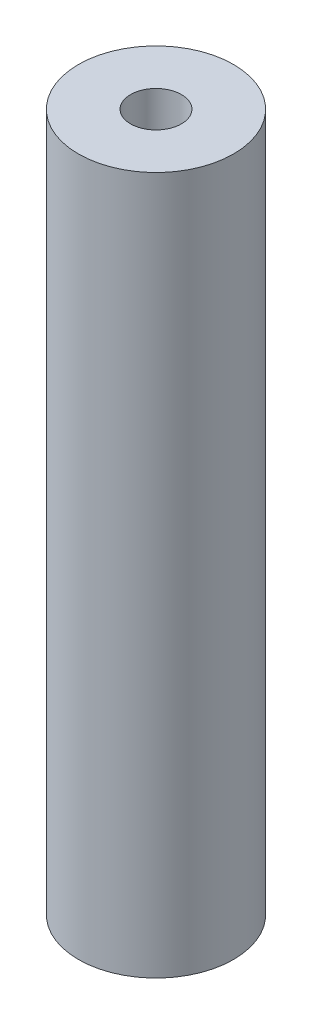
ISO-10303-21;
HEADER;
FILE_DESCRIPTION(('STEP AP214'),'2;1');
FILE_NAME('part.step','',(''),(''),'','','');
FILE_SCHEMA(('AUTOMOTIVE_DESIGN { 1 0 10303 214 1 1 1 1 }'));
ENDSEC;
DATA;
#1=APPLICATION_CONTEXT('core data for automotive mechanical design processes');
#2=APPLICATION_PROTOCOL_DEFINITION('international standard','automotive_design',2000,#1);
#3=PRODUCT_CONTEXT('',#1,'mechanical');
#4=PRODUCT('Part','Part','',(#3));
#5=PRODUCT_RELATED_PRODUCT_CATEGORY('part','',(#4));
#6=PRODUCT_DEFINITION_FORMATION('','',#4);
#7=PRODUCT_DEFINITION_CONTEXT('part definition',#1,'design');
#8=PRODUCT_DEFINITION('design','',#6,#7);
#9=PRODUCT_DEFINITION_SHAPE('','',#8);
#10=(LENGTH_UNIT() NAMED_UNIT(*) SI_UNIT(.MILLI.,.METRE.));
#11=(NAMED_UNIT(*) PLANE_ANGLE_UNIT() SI_UNIT($,.RADIAN.));
#12=(NAMED_UNIT(*) SI_UNIT($,.STERADIAN.) SOLID_ANGLE_UNIT());
#13=UNCERTAINTY_MEASURE_WITH_UNIT(LENGTH_MEASURE(1.E-05),#10,'distance_accuracy_value','');
#14=(GEOMETRIC_REPRESENTATION_CONTEXT(3) GLOBAL_UNCERTAINTY_ASSIGNED_CONTEXT((#13)) GLOBAL_UNIT_ASSIGNED_CONTEXT((#10,
#11,#12)) REPRESENTATION_CONTEXT('',''));
#15=CARTESIAN_POINT('',(0.,0.,0.));
#16=DIRECTION('',(0.,0.,1.));
#17=DIRECTION('',(1.,0.,0.));
#18=AXIS2_PLACEMENT_3D('',#15,#16,#17);
#19=CARTESIAN_POINT('',(0.,42.5,0.));
#20=DIRECTION('',(0.,1.,0.));
#21=DIRECTION('',(0.,0.,1.));
#22=AXIS2_PLACEMENT_3D('',#19,#20,#21);
#23=PLANE('',#22);
#24=CARTESIAN_POINT('',(0.,42.5,0.));
#25=DIRECTION('',(0.,1.,0.));
#26=DIRECTION('',(0.,0.,1.));
#27=AXIS2_PLACEMENT_3D('',#24,#25,#26);
#28=CIRCLE('',#27,4.725);
#29=CARTESIAN_POINT('',(0.,42.5,4.725));
#30=VERTEX_POINT('',#29);
#31=EDGE_CURVE('E10',#30,#30,#28,.T.);
#32=ORIENTED_EDGE('',*,*,#31,.T.);
#33=EDGE_LOOP('',(#32));
#34=FACE_BOUND('',#33,.T.);
#35=CARTESIAN_POINT('',(0.,42.5,0.));
#36=DIRECTION('',(0.,1.,0.));
#37=DIRECTION('',(0.,0.,1.));
#38=AXIS2_PLACEMENT_3D('',#35,#36,#37);
#39=CIRCLE('',#38,1.55);
#40=CARTESIAN_POINT('',(0.,42.5,1.55));
#41=VERTEX_POINT('',#40);
#42=EDGE_CURVE('E56',#41,#41,#39,.T.);
#43=ORIENTED_EDGE('',*,*,#42,.F.);
#44=EDGE_LOOP('',(#43));
#45=FACE_BOUND('',#44,.T.);
#46=ADVANCED_FACE('F43',(#34,#45),#23,.T.);
#47=CARTESIAN_POINT('',(0.,0.,0.));
#48=DIRECTION('',(0.,1.,0.));
#49=DIRECTION('',(0.,0.,1.));
#50=AXIS2_PLACEMENT_3D('',#47,#48,#49);
#51=PLANE('',#50);
#52=CARTESIAN_POINT('',(0.,0.,0.));
#53=DIRECTION('',(0.,1.,0.));
#54=DIRECTION('',(0.,0.,1.));
#55=AXIS2_PLACEMENT_3D('',#52,#53,#54);
#56=CIRCLE('',#55,4.725);
#57=CARTESIAN_POINT('',(0.,0.,4.725));
#58=VERTEX_POINT('',#57);
#59=EDGE_CURVE('E47',#58,#58,#56,.T.);
#60=ORIENTED_EDGE('',*,*,#59,.F.);
#61=EDGE_LOOP('',(#60));
#62=FACE_BOUND('',#61,.T.);
#63=CARTESIAN_POINT('',(0.,0.,0.));
#64=DIRECTION('',(0.,1.,0.));
#65=DIRECTION('',(0.,0.,1.));
#66=AXIS2_PLACEMENT_3D('',#63,#64,#65);
#67=CIRCLE('',#66,1.55);
#68=CARTESIAN_POINT('',(0.,0.,1.55));
#69=VERTEX_POINT('',#68);
#70=EDGE_CURVE('E58',#69,#69,#67,.T.);
#71=ORIENTED_EDGE('',*,*,#70,.T.);
#72=EDGE_LOOP('',(#71));
#73=FACE_BOUND('',#72,.T.);
#74=ADVANCED_FACE('F70',(#62,#73),#51,.F.);
#75=CARTESIAN_POINT('',(0.,42.5,0.));
#76=DIRECTION('',(0.,-1.,0.));
#77=DIRECTION('',(0.,0.,-1.));
#78=AXIS2_PLACEMENT_3D('',#75,#76,#77);
#79=CYLINDRICAL_SURFACE('',#78,4.725);
#80=ORIENTED_EDGE('',*,*,#31,.F.);
#81=EDGE_LOOP('',(#80));
#82=FACE_BOUND('',#81,.T.);
#83=ORIENTED_EDGE('',*,*,#59,.T.);
#84=EDGE_LOOP('',(#83));
#85=FACE_BOUND('',#84,.T.);
#86=ADVANCED_FACE('F45',(#82,#85),#79,.T.);
#87=CARTESIAN_POINT('',(0.,42.5,0.));
#88=DIRECTION('',(0.,-1.,0.));
#89=DIRECTION('',(0.,0.,-1.));
#90=AXIS2_PLACEMENT_3D('',#87,#88,#89);
#91=CYLINDRICAL_SURFACE('',#90,1.55);
#92=ORIENTED_EDGE('',*,*,#42,.T.);
#93=EDGE_LOOP('',(#92));
#94=FACE_BOUND('',#93,.T.);
#95=ORIENTED_EDGE('',*,*,#70,.F.);
#96=EDGE_LOOP('',(#95));
#97=FACE_BOUND('',#96,.T.);
#98=ADVANCED_FACE('F66',(#94,#97),#91,.F.);
#99=CLOSED_SHELL('',(#46,#74,#86,#98));
#100=MANIFOLD_SOLID_BREP('B2',#99);
#101=ADVANCED_BREP_SHAPE_REPRESENTATION('',(#18,#100),#14);
#102=SHAPE_DEFINITION_REPRESENTATION(#9,#101);
ENDSEC;
END-ISO-10303-21;
